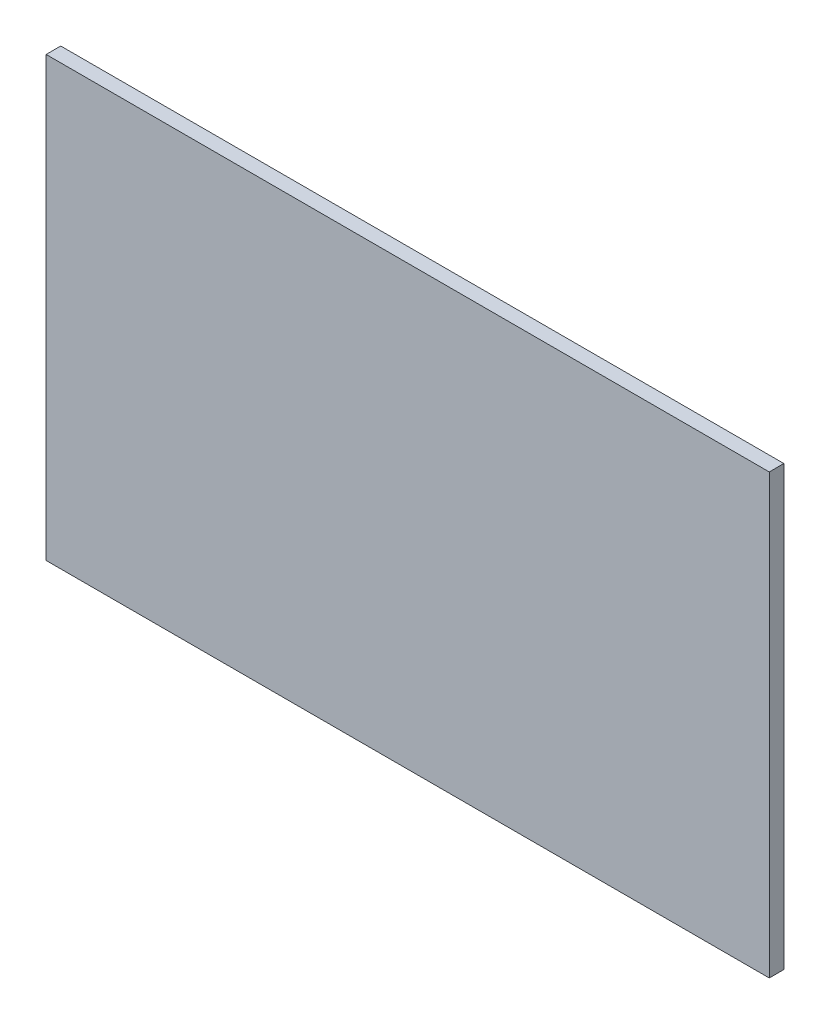
ISO-10303-21;
HEADER;
FILE_DESCRIPTION(('STEP AP214'),'2;1');
FILE_NAME('part.step','',(''),(''),'','','');
FILE_SCHEMA(('AUTOMOTIVE_DESIGN { 1 0 10303 214 1 1 1 1 }'));
ENDSEC;
DATA;
#1=APPLICATION_CONTEXT('core data for automotive mechanical design processes');
#2=APPLICATION_PROTOCOL_DEFINITION('international standard','automotive_design',2000,#1);
#3=PRODUCT_CONTEXT('',#1,'mechanical');
#4=PRODUCT('Part','Part','',(#3));
#5=PRODUCT_RELATED_PRODUCT_CATEGORY('part','',(#4));
#6=PRODUCT_DEFINITION_FORMATION('','',#4);
#7=PRODUCT_DEFINITION_CONTEXT('part definition',#1,'design');
#8=PRODUCT_DEFINITION('design','',#6,#7);
#9=PRODUCT_DEFINITION_SHAPE('','',#8);
#10=(LENGTH_UNIT() NAMED_UNIT(*) SI_UNIT(.MILLI.,.METRE.));
#11=(NAMED_UNIT(*) PLANE_ANGLE_UNIT() SI_UNIT($,.RADIAN.));
#12=(NAMED_UNIT(*) SI_UNIT($,.STERADIAN.) SOLID_ANGLE_UNIT());
#13=UNCERTAINTY_MEASURE_WITH_UNIT(LENGTH_MEASURE(1.E-05),#10,'distance_accuracy_value','');
#14=(GEOMETRIC_REPRESENTATION_CONTEXT(3) GLOBAL_UNCERTAINTY_ASSIGNED_CONTEXT((#13)) GLOBAL_UNIT_ASSIGNED_CONTEXT((#10,
#11,#12)) REPRESENTATION_CONTEXT('',''));
#15=CARTESIAN_POINT('',(0.,0.,0.));
#16=DIRECTION('',(0.,0.,1.));
#17=DIRECTION('',(1.,0.,0.));
#18=AXIS2_PLACEMENT_3D('',#15,#16,#17);
#19=CARTESIAN_POINT('',(-80.8623313420948,23.2993158104341,10.));
#20=DIRECTION('',(1.,0.,0.));
#21=DIRECTION('',(0.,0.,-1.));
#22=AXIS2_PLACEMENT_3D('',#19,#20,#21);
#23=PLANE('',#22);
#24=DIRECTION('',(0.,-1.,0.));
#25=VECTOR('',#24,1.);
#26=CARTESIAN_POINT('',(-80.8623313420948,23.2993158104341,0.));
#27=LINE('',#26,#25);
#28=CARTESIAN_POINT('',(-80.8623313420948,23.2993158104341,0.));
#29=VERTEX_POINT('',#28);
#30=CARTESIAN_POINT('',(-80.8623313420948,-276.700684189566,0.));
#31=VERTEX_POINT('',#30);
#32=EDGE_CURVE('E83',#29,#31,#27,.T.);
#33=ORIENTED_EDGE('',*,*,#32,.T.);
#34=DIRECTION('',(0.,0.,1.));
#35=VECTOR('',#34,1.);
#36=CARTESIAN_POINT('',(-80.8623313420948,-276.700684189566,0.));
#37=LINE('',#36,#35);
#38=CARTESIAN_POINT('',(-80.8623313420948,-276.700684189566,10.));
#39=VERTEX_POINT('',#38);
#40=EDGE_CURVE('E49',#31,#39,#37,.T.);
#41=ORIENTED_EDGE('',*,*,#40,.T.);
#42=DIRECTION('',(0.,-1.,0.));
#43=VECTOR('',#42,1.);
#44=CARTESIAN_POINT('',(-80.8623313420948,23.2993158104341,10.));
#45=LINE('',#44,#43);
#46=CARTESIAN_POINT('',(-80.8623313420948,23.2993158104341,10.));
#47=VERTEX_POINT('',#46);
#48=EDGE_CURVE('E78',#47,#39,#45,.T.);
#49=ORIENTED_EDGE('',*,*,#48,.F.);
#50=DIRECTION('',(0.,0.,-1.));
#51=VECTOR('',#50,1.);
#52=CARTESIAN_POINT('',(-80.8623313420948,23.2993158104341,10.));
#53=LINE('',#52,#51);
#54=EDGE_CURVE('E42',#47,#29,#53,.T.);
#55=ORIENTED_EDGE('',*,*,#54,.T.);
#56=EDGE_LOOP('',(#33,#41,#49,#55));
#57=FACE_BOUND('',#56,.T.);
#58=ADVANCED_FACE('F35',(#57),#23,.F.);
#59=CARTESIAN_POINT('',(414.137668657905,23.2993158104341,10.));
#60=DIRECTION('',(-1.,0.,0.));
#61=DIRECTION('',(0.,0.,1.));
#62=AXIS2_PLACEMENT_3D('',#59,#60,#61);
#63=PLANE('',#62);
#64=DIRECTION('',(0.,1.,0.));
#65=VECTOR('',#64,1.);
#66=CARTESIAN_POINT('',(414.137668657905,23.2993158104341,10.));
#67=LINE('',#66,#65);
#68=CARTESIAN_POINT('',(414.137668657905,-276.700684189566,10.));
#69=VERTEX_POINT('',#68);
#70=CARTESIAN_POINT('',(414.137668657905,23.2993158104341,10.));
#71=VERTEX_POINT('',#70);
#72=EDGE_CURVE('E92',#69,#71,#67,.T.);
#73=ORIENTED_EDGE('',*,*,#72,.F.);
#74=DIRECTION('',(0.,0.,1.));
#75=VECTOR('',#74,1.);
#76=CARTESIAN_POINT('',(414.137668657905,-276.700684189566,0.));
#77=LINE('',#76,#75);
#78=CARTESIAN_POINT('',(414.137668657905,-276.700684189566,0.));
#79=VERTEX_POINT('',#78);
#80=EDGE_CURVE('E88',#79,#69,#77,.T.);
#81=ORIENTED_EDGE('',*,*,#80,.F.);
#82=DIRECTION('',(0.,1.,0.));
#83=VECTOR('',#82,1.);
#84=CARTESIAN_POINT('',(414.137668657905,23.2993158104341,0.));
#85=LINE('',#84,#83);
#86=CARTESIAN_POINT('',(414.137668657905,23.2993158104341,0.));
#87=VERTEX_POINT('',#86);
#88=EDGE_CURVE('E79',#79,#87,#85,.T.);
#89=ORIENTED_EDGE('',*,*,#88,.T.);
#90=DIRECTION('',(0.,0.,-1.));
#91=VECTOR('',#90,1.);
#92=CARTESIAN_POINT('',(414.137668657905,23.2993158104341,10.));
#93=LINE('',#92,#91);
#94=EDGE_CURVE('E11',#71,#87,#93,.T.);
#95=ORIENTED_EDGE('',*,*,#94,.F.);
#96=EDGE_LOOP('',(#73,#81,#89,#95));
#97=FACE_BOUND('',#96,.T.);
#98=ADVANCED_FACE('F114',(#97),#63,.F.);
#99=CARTESIAN_POINT('',(-80.8623313420948,23.2993158104341,10.));
#100=DIRECTION('',(0.,-1.,0.));
#101=DIRECTION('',(0.,0.,-1.));
#102=AXIS2_PLACEMENT_3D('',#99,#100,#101);
#103=PLANE('',#102);
#104=DIRECTION('',(-1.,0.,0.));
#105=VECTOR('',#104,1.);
#106=CARTESIAN_POINT('',(-80.8623313420948,23.2993158104341,0.));
#107=LINE('',#106,#105);
#108=EDGE_CURVE('E70',#87,#29,#107,.T.);
#109=ORIENTED_EDGE('',*,*,#108,.T.);
#110=ORIENTED_EDGE('',*,*,#54,.F.);
#111=DIRECTION('',(-1.,0.,0.));
#112=VECTOR('',#111,1.);
#113=CARTESIAN_POINT('',(-80.8623313420948,23.2993158104341,10.));
#114=LINE('',#113,#112);
#115=EDGE_CURVE('E58',#71,#47,#114,.T.);
#116=ORIENTED_EDGE('',*,*,#115,.F.);
#117=ORIENTED_EDGE('',*,*,#94,.T.);
#118=EDGE_LOOP('',(#109,#110,#116,#117));
#119=FACE_BOUND('',#118,.T.);
#120=ADVANCED_FACE('F72',(#119),#103,.F.);
#121=CARTESIAN_POINT('',(0.,0.,10.));
#122=DIRECTION('',(0.,0.,1.));
#123=DIRECTION('',(1.,0.,0.));
#124=AXIS2_PLACEMENT_3D('',#121,#122,#123);
#125=PLANE('',#124);
#126=DIRECTION('',(-1.,0.,0.));
#127=VECTOR('',#126,1.);
#128=CARTESIAN_POINT('',(-80.8623313420948,-276.700684189566,10.));
#129=LINE('',#128,#127);
#130=EDGE_CURVE('E97',#69,#39,#129,.T.);
#131=ORIENTED_EDGE('',*,*,#130,.F.);
#132=ORIENTED_EDGE('',*,*,#72,.T.);
#133=ORIENTED_EDGE('',*,*,#115,.T.);
#134=ORIENTED_EDGE('',*,*,#48,.T.);
#135=EDGE_LOOP('',(#131,#132,#133,#134));
#136=FACE_BOUND('',#135,.T.);
#137=ADVANCED_FACE('F105',(#136),#125,.T.);
#138=CARTESIAN_POINT('',(0.,0.,0.));
#139=DIRECTION('',(0.,0.,1.));
#140=DIRECTION('',(1.,0.,0.));
#141=AXIS2_PLACEMENT_3D('',#138,#139,#140);
#142=PLANE('',#141);
#143=ORIENTED_EDGE('',*,*,#88,.F.);
#144=DIRECTION('',(-1.,0.,0.));
#145=VECTOR('',#144,1.);
#146=CARTESIAN_POINT('',(-80.8623313420948,-276.700684189566,0.));
#147=LINE('',#146,#145);
#148=EDGE_CURVE('E85',#79,#31,#147,.T.);
#149=ORIENTED_EDGE('',*,*,#148,.T.);
#150=ORIENTED_EDGE('',*,*,#32,.F.);
#151=ORIENTED_EDGE('',*,*,#108,.F.);
#152=EDGE_LOOP('',(#143,#149,#150,#151));
#153=FACE_BOUND('',#152,.T.);
#154=ADVANCED_FACE('F84',(#153),#142,.F.);
#155=CARTESIAN_POINT('',(-80.8623313420948,-276.700684189566,0.));
#156=DIRECTION('',(0.,1.,0.));
#157=DIRECTION('',(0.,0.,1.));
#158=AXIS2_PLACEMENT_3D('',#155,#156,#157);
#159=PLANE('',#158);
#160=ORIENTED_EDGE('',*,*,#130,.T.);
#161=ORIENTED_EDGE('',*,*,#40,.F.);
#162=ORIENTED_EDGE('',*,*,#148,.F.);
#163=ORIENTED_EDGE('',*,*,#80,.T.);
#164=EDGE_LOOP('',(#160,#161,#162,#163));
#165=FACE_BOUND('',#164,.T.);
#166=ADVANCED_FACE('F101',(#165),#159,.F.);
#167=CLOSED_SHELL('',(#58,#98,#120,#137,#154,#166));
#168=MANIFOLD_SOLID_BREP('B2',#167);
#169=ADVANCED_BREP_SHAPE_REPRESENTATION('',(#18,#168),#14);
#170=SHAPE_DEFINITION_REPRESENTATION(#9,#169);
ENDSEC;
END-ISO-10303-21;
